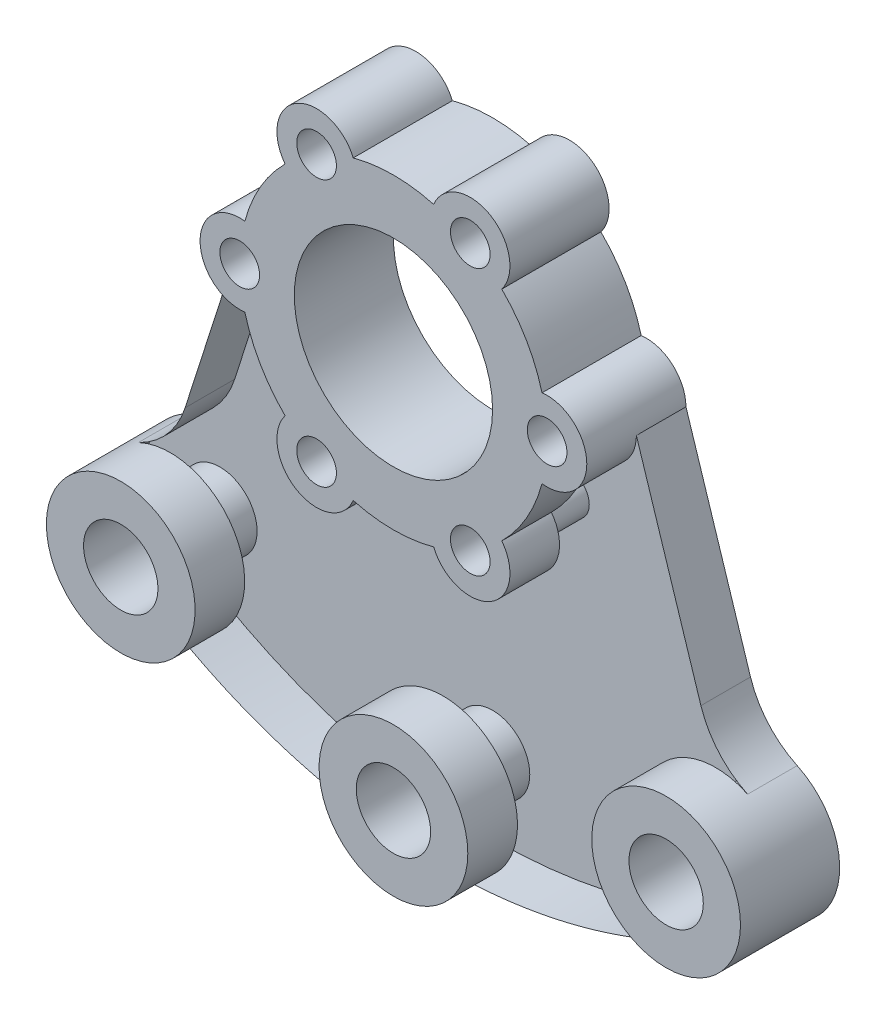
ISO-10303-21;
HEADER;
FILE_DESCRIPTION(('STEP AP214'),'2;1');
FILE_NAME('part.step','',(''),(''),'','','');
FILE_SCHEMA(('AUTOMOTIVE_DESIGN { 1 0 10303 214 1 1 1 1 }'));
ENDSEC;
DATA;
#1=APPLICATION_CONTEXT('core data for automotive mechanical design processes');
#2=APPLICATION_PROTOCOL_DEFINITION('international standard','automotive_design',2000,#1);
#3=PRODUCT_CONTEXT('',#1,'mechanical');
#4=PRODUCT('Part','Part','',(#3));
#5=PRODUCT_RELATED_PRODUCT_CATEGORY('part','',(#4));
#6=PRODUCT_DEFINITION_FORMATION('','',#4);
#7=PRODUCT_DEFINITION_CONTEXT('part definition',#1,'design');
#8=PRODUCT_DEFINITION('design','',#6,#7);
#9=PRODUCT_DEFINITION_SHAPE('','',#8);
#10=(LENGTH_UNIT() NAMED_UNIT(*) SI_UNIT(.MILLI.,.METRE.));
#11=(NAMED_UNIT(*) PLANE_ANGLE_UNIT() SI_UNIT($,.RADIAN.));
#12=(NAMED_UNIT(*) SI_UNIT($,.STERADIAN.) SOLID_ANGLE_UNIT());
#13=UNCERTAINTY_MEASURE_WITH_UNIT(LENGTH_MEASURE(1.E-05),#10,'distance_accuracy_value','');
#14=(GEOMETRIC_REPRESENTATION_CONTEXT(3) GLOBAL_UNCERTAINTY_ASSIGNED_CONTEXT((#13)) GLOBAL_UNIT_ASSIGNED_CONTEXT((#10,
#11,#12)) REPRESENTATION_CONTEXT('',''));
#15=CARTESIAN_POINT('',(0.,0.,0.));
#16=DIRECTION('',(0.,0.,1.));
#17=DIRECTION('',(1.,0.,0.));
#18=AXIS2_PLACEMENT_3D('',#15,#16,#17);
#19=CARTESIAN_POINT('',(0.,0.,20.));
#20=DIRECTION('',(0.,0.,-1.));
#21=DIRECTION('',(-1.,0.,0.));
#22=AXIS2_PLACEMENT_3D('',#19,#20,#21);
#23=CYLINDRICAL_SURFACE('',#22,31.);
#24=CARTESIAN_POINT('',(0.,0.,10.));
#25=DIRECTION('',(0.,0.,-1.));
#26=DIRECTION('',(-1.,0.,0.));
#27=AXIS2_PLACEMENT_3D('',#24,#25,#26);
#28=CIRCLE('',#27,31.);
#29=CARTESIAN_POINT('',(29.9677419354839,-7.93312317364614,10.));
#30=VERTEX_POINT('',#29);
#31=CARTESIAN_POINT('',(21.8541571674705,-21.9862642233623,10.));
#32=VERTEX_POINT('',#31);
#33=EDGE_CURVE('E65',#30,#32,#28,.T.);
#34=ORIENTED_EDGE('',*,*,#33,.F.);
#35=DIRECTION('',(0.,0.,-1.));
#36=VECTOR('',#35,1.);
#37=CARTESIAN_POINT('',(29.9677419354839,-7.93312317364614,20.));
#38=LINE('',#37,#36);
#39=CARTESIAN_POINT('',(29.9677419354839,-7.93312317364614,20.));
#40=VERTEX_POINT('',#39);
#41=EDGE_CURVE('E350',#40,#30,#38,.T.);
#42=ORIENTED_EDGE('',*,*,#41,.F.);
#43=CARTESIAN_POINT('',(0.,0.,20.));
#44=DIRECTION('',(0.,0.,1.));
#45=DIRECTION('',(1.,0.,0.));
#46=AXIS2_PLACEMENT_3D('',#43,#44,#45);
#47=CIRCLE('',#46,31.);
#48=CARTESIAN_POINT('',(21.8541571674705,-21.9862642233623,20.));
#49=VERTEX_POINT('',#48);
#50=EDGE_CURVE('E280',#49,#40,#47,.T.);
#51=ORIENTED_EDGE('',*,*,#50,.F.);
#52=DIRECTION('',(0.,0.,-1.));
#53=VECTOR('',#52,1.);
#54=CARTESIAN_POINT('',(21.8541571674705,-21.9862642233623,20.));
#55=LINE('',#54,#53);
#56=EDGE_CURVE('E306',#49,#32,#55,.T.);
#57=ORIENTED_EDGE('',*,*,#56,.T.);
#58=EDGE_LOOP('',(#34,#42,#51,#57));
#59=FACE_BOUND('',#58,.T.);
#60=ADVANCED_FACE('F43',(#59),#23,.T.);
#61=CARTESIAN_POINT('',(31.,0.,20.));
#62=DIRECTION('',(0.,0.,-1.));
#63=DIRECTION('',(-1.,0.,0.));
#64=AXIS2_PLACEMENT_3D('',#61,#62,#63);
#65=CYLINDRICAL_SURFACE('',#64,8.);
#66=DIRECTION('',(0.,0.,-1.));
#67=VECTOR('',#66,1.);
#68=CARTESIAN_POINT('',(39.,0.,10.));
#69=LINE('',#68,#67);
#70=CARTESIAN_POINT('',(39.,0.,10.));
#71=VERTEX_POINT('',#70);
#72=CARTESIAN_POINT('',(39.,0.,0.));
#73=VERTEX_POINT('',#72);
#74=EDGE_CURVE('E370',#71,#73,#69,.T.);
#75=ORIENTED_EDGE('',*,*,#74,.T.);
#76=CARTESIAN_POINT('',(31.,0.,0.));
#77=DIRECTION('',(0.,0.,1.));
#78=DIRECTION('',(1.,0.,0.));
#79=AXIS2_PLACEMENT_3D('',#76,#77,#78);
#80=CIRCLE('',#79,8.);
#81=CARTESIAN_POINT('',(29.9677419354839,7.93312317364614,0.));
#82=VERTEX_POINT('',#81);
#83=EDGE_CURVE('E277',#73,#82,#80,.T.);
#84=ORIENTED_EDGE('',*,*,#83,.T.);
#85=DIRECTION('',(0.,0.,-1.));
#86=VECTOR('',#85,1.);
#87=CARTESIAN_POINT('',(29.9677419354839,7.93312317364614,20.));
#88=LINE('',#87,#86);
#89=CARTESIAN_POINT('',(29.9677419354839,7.93312317364614,20.));
#90=VERTEX_POINT('',#89);
#91=EDGE_CURVE('E347',#90,#82,#88,.T.);
#92=ORIENTED_EDGE('',*,*,#91,.F.);
#93=CARTESIAN_POINT('',(31.,0.,20.));
#94=DIRECTION('',(0.,0.,1.));
#95=DIRECTION('',(1.,0.,0.));
#96=AXIS2_PLACEMENT_3D('',#93,#94,#95);
#97=CIRCLE('',#96,8.);
#98=EDGE_CURVE('E283',#40,#90,#97,.T.);
#99=ORIENTED_EDGE('',*,*,#98,.F.);
#100=ORIENTED_EDGE('',*,*,#41,.T.);
#101=CARTESIAN_POINT('',(31.,0.,10.));
#102=DIRECTION('',(0.,0.,-1.));
#103=DIRECTION('',(-1.,0.,0.));
#104=AXIS2_PLACEMENT_3D('',#101,#102,#103);
#105=CIRCLE('',#104,8.);
#106=EDGE_CURVE('E57',#71,#30,#105,.T.);
#107=ORIENTED_EDGE('',*,*,#106,.F.);
#108=EDGE_LOOP('',(#75,#84,#92,#99,#100,#107));
#109=FACE_BOUND('',#108,.T.);
#110=ADVANCED_FACE('F484',(#109),#65,.T.);
#111=CARTESIAN_POINT('',(-31.,2.16471843008274E-13,20.));
#112=DIRECTION('',(0.,0.,-1.));
#113=DIRECTION('',(-1.,0.,0.));
#114=AXIS2_PLACEMENT_3D('',#111,#112,#113);
#115=CYLINDRICAL_SURFACE('',#114,7.99999999999998);
#116=DIRECTION('',(0.,0.,-1.));
#117=VECTOR('',#116,1.);
#118=CARTESIAN_POINT('',(-39.,0.,10.));
#119=LINE('',#118,#117);
#120=CARTESIAN_POINT('',(-39.,0.,10.));
#121=VERTEX_POINT('',#120);
#122=CARTESIAN_POINT('',(-39.,0.,0.));
#123=VERTEX_POINT('',#122);
#124=EDGE_CURVE('E221',#121,#123,#119,.T.);
#125=ORIENTED_EDGE('',*,*,#124,.F.);
#126=CARTESIAN_POINT('',(-31.,2.16471843008274E-13,10.));
#127=DIRECTION('',(0.,0.,-1.));
#128=DIRECTION('',(-1.,0.,0.));
#129=AXIS2_PLACEMENT_3D('',#126,#127,#128);
#130=CIRCLE('',#129,7.99999999999998);
#131=CARTESIAN_POINT('',(-29.9677419354839,-7.93312317364591,10.));
#132=VERTEX_POINT('',#131);
#133=EDGE_CURVE('E239',#132,#121,#130,.T.);
#134=ORIENTED_EDGE('',*,*,#133,.F.);
#135=DIRECTION('',(0.,0.,-1.));
#136=VECTOR('',#135,1.);
#137=CARTESIAN_POINT('',(-29.9677419354839,-7.93312317364591,20.));
#138=LINE('',#137,#136);
#139=CARTESIAN_POINT('',(-29.9677419354839,-7.93312317364591,20.));
#140=VERTEX_POINT('',#139);
#141=EDGE_CURVE('E329',#140,#132,#138,.T.);
#142=ORIENTED_EDGE('',*,*,#141,.F.);
#143=CARTESIAN_POINT('',(-31.,2.16471843008274E-13,20.));
#144=DIRECTION('',(0.,0.,1.));
#145=DIRECTION('',(1.,0.,0.));
#146=AXIS2_PLACEMENT_3D('',#143,#144,#145);
#147=CIRCLE('',#146,7.99999999999998);
#148=CARTESIAN_POINT('',(-29.9677419354838,7.93312317364632,20.));
#149=VERTEX_POINT('',#148);
#150=EDGE_CURVE('E296',#149,#140,#147,.T.);
#151=ORIENTED_EDGE('',*,*,#150,.F.);
#152=DIRECTION('',(0.,0.,-1.));
#153=VECTOR('',#152,1.);
#154=CARTESIAN_POINT('',(-29.9677419354838,7.93312317364632,20.));
#155=LINE('',#154,#153);
#156=CARTESIAN_POINT('',(-29.9677419354838,7.93312317364632,0.));
#157=VERTEX_POINT('',#156);
#158=EDGE_CURVE('E332',#149,#157,#155,.T.);
#159=ORIENTED_EDGE('',*,*,#158,.T.);
#160=CARTESIAN_POINT('',(-31.,2.16471843008274E-13,0.));
#161=DIRECTION('',(0.,0.,1.));
#162=DIRECTION('',(1.,0.,0.));
#163=AXIS2_PLACEMENT_3D('',#160,#161,#162);
#164=CIRCLE('',#163,7.99999999999998);
#165=EDGE_CURVE('E284',#157,#123,#164,.T.);
#166=ORIENTED_EDGE('',*,*,#165,.T.);
#167=EDGE_LOOP('',(#125,#134,#142,#151,#159,#166));
#168=FACE_BOUND('',#167,.T.);
#169=ADVANCED_FACE('F426',(#168),#115,.T.);
#170=CARTESIAN_POINT('',(0.,0.,20.));
#171=DIRECTION('',(0.,0.,-1.));
#172=DIRECTION('',(-1.,0.,0.));
#173=AXIS2_PLACEMENT_3D('',#170,#171,#172);
#174=CYLINDRICAL_SURFACE('',#173,31.);
#175=CARTESIAN_POINT('',(0.,0.,10.));
#176=DIRECTION('',(0.,0.,-1.));
#177=DIRECTION('',(-1.,0.,0.));
#178=AXIS2_PLACEMENT_3D('',#175,#176,#177);
#179=CIRCLE('',#178,31.);
#180=CARTESIAN_POINT('',(-21.8541571674706,-21.9862642233621,10.));
#181=VERTEX_POINT('',#180);
#182=EDGE_CURVE('E236',#181,#132,#179,.T.);
#183=ORIENTED_EDGE('',*,*,#182,.F.);
#184=DIRECTION('',(0.,0.,-1.));
#185=VECTOR('',#184,1.);
#186=CARTESIAN_POINT('',(-21.8541571674706,-21.9862642233621,20.));
#187=LINE('',#186,#185);
#188=CARTESIAN_POINT('',(-21.8541571674706,-21.9862642233621,20.));
#189=VERTEX_POINT('',#188);
#190=EDGE_CURVE('E326',#189,#181,#187,.T.);
#191=ORIENTED_EDGE('',*,*,#190,.F.);
#192=CARTESIAN_POINT('',(0.,0.,20.));
#193=DIRECTION('',(0.,0.,1.));
#194=DIRECTION('',(1.,0.,0.));
#195=AXIS2_PLACEMENT_3D('',#192,#193,#194);
#196=CIRCLE('',#195,31.);
#197=EDGE_CURVE('E298',#140,#189,#196,.T.);
#198=ORIENTED_EDGE('',*,*,#197,.F.);
#199=ORIENTED_EDGE('',*,*,#141,.T.);
#200=EDGE_LOOP('',(#183,#191,#198,#199));
#201=FACE_BOUND('',#200,.T.);
#202=ADVANCED_FACE('F421',(#201),#174,.T.);
#203=CARTESIAN_POINT('',(-15.5000000000001,-26.8467875173175,20.));
#204=DIRECTION('',(0.,0.,-1.));
#205=DIRECTION('',(-1.,0.,0.));
#206=AXIS2_PLACEMENT_3D('',#203,#204,#205);
#207=CYLINDRICAL_SURFACE('',#206,8.);
#208=CARTESIAN_POINT('',(-15.5000000000001,-26.8467875173175,10.));
#209=DIRECTION('',(0.,0.,-1.));
#210=DIRECTION('',(-1.,0.,0.));
#211=AXIS2_PLACEMENT_3D('',#208,#209,#210);
#212=CIRCLE('',#211,8.);
#213=CARTESIAN_POINT('',(-8.11358476801349,-29.9193873970083,10.));
#214=VERTEX_POINT('',#213);
#215=EDGE_CURVE('E233',#214,#181,#212,.T.);
#216=ORIENTED_EDGE('',*,*,#215,.F.);
#217=DIRECTION('',(0.,0.,-1.));
#218=VECTOR('',#217,1.);
#219=CARTESIAN_POINT('',(-8.11358476801349,-29.9193873970083,20.));
#220=LINE('',#219,#218);
#221=CARTESIAN_POINT('',(-8.11358476801349,-29.9193873970083,20.));
#222=VERTEX_POINT('',#221);
#223=EDGE_CURVE('E323',#222,#214,#220,.T.);
#224=ORIENTED_EDGE('',*,*,#223,.F.);
#225=CARTESIAN_POINT('',(-15.5000000000001,-26.8467875173175,20.));
#226=DIRECTION('',(0.,0.,1.));
#227=DIRECTION('',(1.,0.,0.));
#228=AXIS2_PLACEMENT_3D('',#225,#226,#227);
#229=CIRCLE('',#228,8.);
#230=EDGE_CURVE('E300',#189,#222,#229,.T.);
#231=ORIENTED_EDGE('',*,*,#230,.F.);
#232=ORIENTED_EDGE('',*,*,#190,.T.);
#233=EDGE_LOOP('',(#216,#224,#231,#232));
#234=FACE_BOUND('',#233,.T.);
#235=ADVANCED_FACE('F418',(#234),#207,.T.);
#236=CARTESIAN_POINT('',(0.,0.,20.));
#237=DIRECTION('',(0.,0.,-1.));
#238=DIRECTION('',(-1.,0.,0.));
#239=AXIS2_PLACEMENT_3D('',#236,#237,#238);
#240=CYLINDRICAL_SURFACE('',#239,31.);
#241=CARTESIAN_POINT('',(0.,0.,10.));
#242=DIRECTION('',(0.,0.,-1.));
#243=DIRECTION('',(-1.,0.,0.));
#244=AXIS2_PLACEMENT_3D('',#241,#242,#243);
#245=CIRCLE('',#244,31.);
#246=CARTESIAN_POINT('',(8.11358476801328,-29.9193873970084,10.));
#247=VERTEX_POINT('',#246);
#248=EDGE_CURVE('E230',#247,#214,#245,.T.);
#249=ORIENTED_EDGE('',*,*,#248,.F.);
#250=DIRECTION('',(0.,0.,-1.));
#251=VECTOR('',#250,1.);
#252=CARTESIAN_POINT('',(8.11358476801328,-29.9193873970084,20.));
#253=LINE('',#252,#251);
#254=CARTESIAN_POINT('',(8.11358476801328,-29.9193873970084,20.));
#255=VERTEX_POINT('',#254);
#256=EDGE_CURVE('E320',#255,#247,#253,.T.);
#257=ORIENTED_EDGE('',*,*,#256,.F.);
#258=CARTESIAN_POINT('',(0.,0.,20.));
#259=DIRECTION('',(0.,0.,1.));
#260=DIRECTION('',(1.,0.,0.));
#261=AXIS2_PLACEMENT_3D('',#258,#259,#260);
#262=CIRCLE('',#261,31.);
#263=EDGE_CURVE('E302',#222,#255,#262,.T.);
#264=ORIENTED_EDGE('',*,*,#263,.F.);
#265=ORIENTED_EDGE('',*,*,#223,.T.);
#266=EDGE_LOOP('',(#249,#257,#264,#265));
#267=FACE_BOUND('',#266,.T.);
#268=ADVANCED_FACE('F416',(#267),#240,.T.);
#269=CARTESIAN_POINT('',(15.4999999999999,-26.8467875173176,20.));
#270=DIRECTION('',(0.,0.,-1.));
#271=DIRECTION('',(-1.,0.,0.));
#272=AXIS2_PLACEMENT_3D('',#269,#270,#271);
#273=CYLINDRICAL_SURFACE('',#272,8.);
#274=CARTESIAN_POINT('',(15.4999999999999,-26.8467875173176,10.));
#275=DIRECTION('',(0.,0.,-1.));
#276=DIRECTION('',(-1.,0.,0.));
#277=AXIS2_PLACEMENT_3D('',#274,#275,#276);
#278=CIRCLE('',#277,8.);
#279=EDGE_CURVE('E227',#32,#247,#278,.T.);
#280=ORIENTED_EDGE('',*,*,#279,.F.);
#281=ORIENTED_EDGE('',*,*,#56,.F.);
#282=CARTESIAN_POINT('',(15.4999999999999,-26.8467875173176,20.));
#283=DIRECTION('',(0.,0.,1.));
#284=DIRECTION('',(1.,0.,0.));
#285=AXIS2_PLACEMENT_3D('',#282,#283,#284);
#286=CIRCLE('',#285,8.);
#287=EDGE_CURVE('E304',#255,#49,#286,.T.);
#288=ORIENTED_EDGE('',*,*,#287,.F.);
#289=ORIENTED_EDGE('',*,*,#256,.T.);
#290=EDGE_LOOP('',(#280,#281,#288,#289));
#291=FACE_BOUND('',#290,.T.);
#292=ADVANCED_FACE('F404',(#291),#273,.T.);
#293=CARTESIAN_POINT('',(0.,0.,20.));
#294=DIRECTION('',(0.,0.,-1.));
#295=DIRECTION('',(-1.,0.,0.));
#296=AXIS2_PLACEMENT_3D('',#293,#294,#295);
#297=CYLINDRICAL_SURFACE('',#296,20.);
#298=CARTESIAN_POINT('',(0.,0.,20.));
#299=DIRECTION('',(0.,0.,1.));
#300=DIRECTION('',(1.,0.,0.));
#301=AXIS2_PLACEMENT_3D('',#298,#299,#300);
#302=CIRCLE('',#301,20.);
#303=CARTESIAN_POINT('',(20.,0.,20.));
#304=VERTEX_POINT('',#303);
#305=EDGE_CURVE('E274',#304,#304,#302,.T.);
#306=ORIENTED_EDGE('',*,*,#305,.T.);
#307=EDGE_LOOP('',(#306));
#308=FACE_BOUND('',#307,.T.);
#309=CARTESIAN_POINT('',(0.,0.,0.));
#310=DIRECTION('',(0.,0.,1.));
#311=DIRECTION('',(1.,0.,0.));
#312=AXIS2_PLACEMENT_3D('',#309,#310,#311);
#313=CIRCLE('',#312,20.);
#314=CARTESIAN_POINT('',(20.,0.,0.));
#315=VERTEX_POINT('',#314);
#316=EDGE_CURVE('E271',#315,#315,#313,.T.);
#317=ORIENTED_EDGE('',*,*,#316,.F.);
#318=EDGE_LOOP('',(#317));
#319=FACE_BOUND('',#318,.T.);
#320=ADVANCED_FACE('F523',(#308,#319),#297,.F.);
#321=CARTESIAN_POINT('',(31.,0.,20.));
#322=DIRECTION('',(0.,0.,-1.));
#323=DIRECTION('',(-1.,0.,0.));
#324=AXIS2_PLACEMENT_3D('',#321,#322,#323);
#325=CYLINDRICAL_SURFACE('',#324,4.00000000000001);
#326=CARTESIAN_POINT('',(31.,0.,20.));
#327=DIRECTION('',(0.,0.,1.));
#328=DIRECTION('',(1.,0.,0.));
#329=AXIS2_PLACEMENT_3D('',#326,#327,#328);
#330=CIRCLE('',#329,4.00000000000001);
#331=CARTESIAN_POINT('',(35.,0.,20.));
#332=VERTEX_POINT('',#331);
#333=EDGE_CURVE('E268',#332,#332,#330,.T.);
#334=ORIENTED_EDGE('',*,*,#333,.T.);
#335=EDGE_LOOP('',(#334));
#336=FACE_BOUND('',#335,.T.);
#337=CARTESIAN_POINT('',(31.,0.,0.));
#338=DIRECTION('',(0.,0.,1.));
#339=DIRECTION('',(1.,0.,0.));
#340=AXIS2_PLACEMENT_3D('',#337,#338,#339);
#341=CIRCLE('',#340,4.00000000000001);
#342=CARTESIAN_POINT('',(35.,0.,0.));
#343=VERTEX_POINT('',#342);
#344=EDGE_CURVE('E267',#343,#343,#341,.T.);
#345=ORIENTED_EDGE('',*,*,#344,.F.);
#346=EDGE_LOOP('',(#345));
#347=FACE_BOUND('',#346,.T.);
#348=ADVANCED_FACE('F532',(#336,#347),#325,.F.);
#349=CARTESIAN_POINT('',(15.4999999999999,-26.8467875173176,20.));
#350=DIRECTION('',(0.,0.,-1.));
#351=DIRECTION('',(-1.,0.,0.));
#352=AXIS2_PLACEMENT_3D('',#349,#350,#351);
#353=CYLINDRICAL_SURFACE('',#352,4.00000000000001);
#354=CARTESIAN_POINT('',(15.4999999999999,-26.8467875173176,20.));
#355=DIRECTION('',(0.,0.,1.));
#356=DIRECTION('',(1.,0.,0.));
#357=AXIS2_PLACEMENT_3D('',#354,#355,#356);
#358=CIRCLE('',#357,4.00000000000001);
#359=CARTESIAN_POINT('',(19.4999999999999,-26.8467875173176,20.));
#360=VERTEX_POINT('',#359);
#361=EDGE_CURVE('E264',#360,#360,#358,.T.);
#362=ORIENTED_EDGE('',*,*,#361,.T.);
#363=EDGE_LOOP('',(#362));
#364=FACE_BOUND('',#363,.T.);
#365=CARTESIAN_POINT('',(15.4999999999999,-26.8467875173176,0.));
#366=DIRECTION('',(0.,0.,1.));
#367=DIRECTION('',(1.,0.,0.));
#368=AXIS2_PLACEMENT_3D('',#365,#366,#367);
#369=CIRCLE('',#368,4.00000000000001);
#370=CARTESIAN_POINT('',(19.4999999999999,-26.8467875173176,0.));
#371=VERTEX_POINT('',#370);
#372=EDGE_CURVE('E453',#371,#371,#369,.T.);
#373=ORIENTED_EDGE('',*,*,#372,.F.);
#374=EDGE_LOOP('',(#373));
#375=FACE_BOUND('',#374,.T.);
#376=ADVANCED_FACE('F536',(#364,#375),#353,.F.);
#377=CARTESIAN_POINT('',(-15.5000000000001,-26.8467875173175,20.));
#378=DIRECTION('',(0.,0.,-1.));
#379=DIRECTION('',(-1.,0.,0.));
#380=AXIS2_PLACEMENT_3D('',#377,#378,#379);
#381=CYLINDRICAL_SURFACE('',#380,4.00000000000001);
#382=CARTESIAN_POINT('',(-15.5000000000001,-26.8467875173175,20.));
#383=DIRECTION('',(0.,0.,1.));
#384=DIRECTION('',(1.,0.,0.));
#385=AXIS2_PLACEMENT_3D('',#382,#383,#384);
#386=CIRCLE('',#385,4.00000000000001);
#387=CARTESIAN_POINT('',(-11.5000000000001,-26.8467875173175,20.));
#388=VERTEX_POINT('',#387);
#389=EDGE_CURVE('E259',#388,#388,#386,.T.);
#390=ORIENTED_EDGE('',*,*,#389,.T.);
#391=EDGE_LOOP('',(#390));
#392=FACE_BOUND('',#391,.T.);
#393=CARTESIAN_POINT('',(-15.5000000000001,-26.8467875173175,0.));
#394=DIRECTION('',(0.,0.,1.));
#395=DIRECTION('',(1.,0.,0.));
#396=AXIS2_PLACEMENT_3D('',#393,#394,#395);
#397=CIRCLE('',#396,4.);
#398=CARTESIAN_POINT('',(-11.5000000000001,-26.8467875173175,0.));
#399=VERTEX_POINT('',#398);
#400=EDGE_CURVE('E450',#399,#399,#397,.T.);
#401=ORIENTED_EDGE('',*,*,#400,.F.);
#402=EDGE_LOOP('',(#401));
#403=FACE_BOUND('',#402,.T.);
#404=ADVANCED_FACE('F540',(#392,#403),#381,.F.);
#405=CARTESIAN_POINT('',(-31.,2.16471843008274E-13,20.));
#406=DIRECTION('',(0.,0.,-1.));
#407=DIRECTION('',(-1.,0.,0.));
#408=AXIS2_PLACEMENT_3D('',#405,#406,#407);
#409=CYLINDRICAL_SURFACE('',#408,4.00000000000001);
#410=CARTESIAN_POINT('',(-31.,2.16471843008274E-13,20.));
#411=DIRECTION('',(0.,0.,1.));
#412=DIRECTION('',(1.,0.,0.));
#413=AXIS2_PLACEMENT_3D('',#410,#411,#412);
#414=CIRCLE('',#413,4.00000000000001);
#415=CARTESIAN_POINT('',(-27.,2.16471843008274E-13,20.));
#416=VERTEX_POINT('',#415);
#417=EDGE_CURVE('E256',#416,#416,#414,.T.);
#418=ORIENTED_EDGE('',*,*,#417,.T.);
#419=EDGE_LOOP('',(#418));
#420=FACE_BOUND('',#419,.T.);
#421=CARTESIAN_POINT('',(-31.,2.16471843008274E-13,0.));
#422=DIRECTION('',(0.,0.,1.));
#423=DIRECTION('',(1.,0.,0.));
#424=AXIS2_PLACEMENT_3D('',#421,#422,#423);
#425=CIRCLE('',#424,4.00000000000001);
#426=CARTESIAN_POINT('',(-27.,2.16471843008274E-13,0.));
#427=VERTEX_POINT('',#426);
#428=EDGE_CURVE('E253',#427,#427,#425,.T.);
#429=ORIENTED_EDGE('',*,*,#428,.F.);
#430=EDGE_LOOP('',(#429));
#431=FACE_BOUND('',#430,.T.);
#432=ADVANCED_FACE('F528',(#420,#431),#409,.F.);
#433=CARTESIAN_POINT('',(15.5,0.,20.));
#434=DIRECTION('',(0.,0.,1.));
#435=DIRECTION('',(1.,0.,0.));
#436=AXIS2_PLACEMENT_3D('',#433,#434,#435);
#437=PLANE('',#436);
#438=CARTESIAN_POINT('',(-15.4999999999997,26.8467875173177,20.));
#439=DIRECTION('',(0.,0.,1.));
#440=DIRECTION('',(1.,0.,0.));
#441=AXIS2_PLACEMENT_3D('',#438,#439,#440);
#442=CIRCLE('',#441,4.);
#443=CARTESIAN_POINT('',(-11.4999999999997,26.8467875173177,20.));
#444=VERTEX_POINT('',#443);
#445=EDGE_CURVE('E250',#444,#444,#442,.T.);
#446=ORIENTED_EDGE('',*,*,#445,.F.);
#447=EDGE_LOOP('',(#446));
#448=FACE_BOUND('',#447,.T.);
#449=ORIENTED_EDGE('',*,*,#389,.F.);
#450=EDGE_LOOP('',(#449));
#451=FACE_BOUND('',#450,.T.);
#452=ORIENTED_EDGE('',*,*,#333,.F.);
#453=EDGE_LOOP('',(#452));
#454=FACE_BOUND('',#453,.T.);
#455=ORIENTED_EDGE('',*,*,#50,.T.);
#456=ORIENTED_EDGE('',*,*,#98,.T.);
#457=CARTESIAN_POINT('',(0.,0.,20.));
#458=DIRECTION('',(0.,0.,1.));
#459=DIRECTION('',(1.,0.,0.));
#460=AXIS2_PLACEMENT_3D('',#457,#458,#459);
#461=CIRCLE('',#460,31.);
#462=CARTESIAN_POINT('',(21.8541571674708,21.9862642233619,20.));
#463=VERTEX_POINT('',#462);
#464=EDGE_CURVE('E286',#90,#463,#461,.T.);
#465=ORIENTED_EDGE('',*,*,#464,.T.);
#466=CARTESIAN_POINT('',(15.5000000000003,26.8467875173174,20.));
#467=DIRECTION('',(0.,0.,1.));
#468=DIRECTION('',(1.,0.,0.));
#469=AXIS2_PLACEMENT_3D('',#466,#467,#468);
#470=CIRCLE('',#469,8.);
#471=CARTESIAN_POINT('',(8.11358476801369,29.9193873970083,20.));
#472=VERTEX_POINT('',#471);
#473=EDGE_CURVE('E288',#463,#472,#470,.T.);
#474=ORIENTED_EDGE('',*,*,#473,.T.);
#475=CARTESIAN_POINT('',(0.,0.,20.));
#476=DIRECTION('',(0.,0.,1.));
#477=DIRECTION('',(1.,0.,0.));
#478=AXIS2_PLACEMENT_3D('',#475,#476,#477);
#479=CIRCLE('',#478,31.);
#480=CARTESIAN_POINT('',(-8.11358476801307,29.9193873970084,20.));
#481=VERTEX_POINT('',#480);
#482=EDGE_CURVE('E290',#472,#481,#479,.T.);
#483=ORIENTED_EDGE('',*,*,#482,.T.);
#484=CARTESIAN_POINT('',(-15.4999999999997,26.8467875173177,20.));
#485=DIRECTION('',(0.,0.,1.));
#486=DIRECTION('',(1.,0.,0.));
#487=AXIS2_PLACEMENT_3D('',#484,#485,#486);
#488=CIRCLE('',#487,8.);
#489=CARTESIAN_POINT('',(-21.8541571674703,21.9862642233624,20.));
#490=VERTEX_POINT('',#489);
#491=EDGE_CURVE('E292',#481,#490,#488,.T.);
#492=ORIENTED_EDGE('',*,*,#491,.T.);
#493=CARTESIAN_POINT('',(0.,0.,20.));
#494=DIRECTION('',(0.,0.,1.));
#495=DIRECTION('',(1.,0.,0.));
#496=AXIS2_PLACEMENT_3D('',#493,#494,#495);
#497=CIRCLE('',#496,31.);
#498=EDGE_CURVE('E294',#490,#149,#497,.T.);
#499=ORIENTED_EDGE('',*,*,#498,.T.);
#500=ORIENTED_EDGE('',*,*,#150,.T.);
#501=ORIENTED_EDGE('',*,*,#197,.T.);
#502=ORIENTED_EDGE('',*,*,#230,.T.);
#503=ORIENTED_EDGE('',*,*,#263,.T.);
#504=ORIENTED_EDGE('',*,*,#287,.T.);
#505=EDGE_LOOP('',(#455,#456,#465,#474,#483,#492,#499,#500,#501,#502,#503,#504));
#506=FACE_BOUND('',#505,.T.);
#507=ORIENTED_EDGE('',*,*,#305,.F.);
#508=EDGE_LOOP('',(#507));
#509=FACE_BOUND('',#508,.T.);
#510=ORIENTED_EDGE('',*,*,#361,.F.);
#511=EDGE_LOOP('',(#510));
#512=FACE_BOUND('',#511,.T.);
#513=ORIENTED_EDGE('',*,*,#417,.F.);
#514=EDGE_LOOP('',(#513));
#515=FACE_BOUND('',#514,.T.);
#516=CARTESIAN_POINT('',(15.5000000000003,26.8467875173174,20.));
#517=DIRECTION('',(0.,0.,1.));
#518=DIRECTION('',(1.,0.,0.));
#519=AXIS2_PLACEMENT_3D('',#516,#517,#518);
#520=CIRCLE('',#519,4.);
#521=CARTESIAN_POINT('',(19.5000000000003,26.8467875173174,20.));
#522=VERTEX_POINT('',#521);
#523=EDGE_CURVE('E244',#522,#522,#520,.T.);
#524=ORIENTED_EDGE('',*,*,#523,.F.);
#525=EDGE_LOOP('',(#524));
#526=FACE_BOUND('',#525,.T.);
#527=ADVANCED_FACE('F409',(#448,#451,#454,#506,#509,#512,#515,#526),#437,.T.);
#528=CARTESIAN_POINT('',(15.5,0.,0.));
#529=DIRECTION('',(0.,0.,1.));
#530=DIRECTION('',(1.,0.,0.));
#531=AXIS2_PLACEMENT_3D('',#528,#529,#530);
#532=PLANE('',#531);
#533=CARTESIAN_POINT('',(-55.,-65.,0.));
#534=DIRECTION('',(0.,0.,1.));
#535=DIRECTION('',(1.,0.,0.));
#536=AXIS2_PLACEMENT_3D('',#533,#534,#535);
#537=CIRCLE('',#536,7.5);
#538=CARTESIAN_POINT('',(-47.5,-65.,0.));
#539=VERTEX_POINT('',#538);
#540=EDGE_CURVE('E449',#539,#539,#537,.T.);
#541=ORIENTED_EDGE('',*,*,#540,.T.);
#542=EDGE_LOOP('',(#541));
#543=FACE_BOUND('',#542,.T.);
#544=CARTESIAN_POINT('',(0.,-80.,0.));
#545=DIRECTION('',(0.,0.,1.));
#546=DIRECTION('',(1.,0.,0.));
#547=AXIS2_PLACEMENT_3D('',#544,#545,#546);
#548=CIRCLE('',#547,7.5);
#549=CARTESIAN_POINT('',(7.50000000000002,-80.,0.));
#550=VERTEX_POINT('',#549);
#551=EDGE_CURVE('E459',#550,#550,#548,.T.);
#552=ORIENTED_EDGE('',*,*,#551,.T.);
#553=EDGE_LOOP('',(#552));
#554=FACE_BOUND('',#553,.T.);
#555=CARTESIAN_POINT('',(55.,-65.,0.));
#556=DIRECTION('',(0.,0.,1.));
#557=DIRECTION('',(1.,0.,0.));
#558=AXIS2_PLACEMENT_3D('',#555,#556,#557);
#559=CIRCLE('',#558,7.5);
#560=CARTESIAN_POINT('',(62.5,-65.,0.));
#561=VERTEX_POINT('',#560);
#562=EDGE_CURVE('E456',#561,#561,#559,.T.);
#563=ORIENTED_EDGE('',*,*,#562,.T.);
#564=EDGE_LOOP('',(#563));
#565=FACE_BOUND('',#564,.T.);
#566=ORIENTED_EDGE('',*,*,#372,.T.);
#567=EDGE_LOOP('',(#566));
#568=FACE_BOUND('',#567,.T.);
#569=ORIENTED_EDGE('',*,*,#400,.T.);
#570=EDGE_LOOP('',(#569));
#571=FACE_BOUND('',#570,.T.);
#572=CARTESIAN_POINT('',(0.,13.3333333333336,0.));
#573=DIRECTION('',(0.,0.,1.));
#574=DIRECTION('',(-1.,0.,0.));
#575=AXIS2_PLACEMENT_3D('',#572,#573,#574);
#576=CIRCLE('',#575,108.333333333334);
#577=CARTESIAN_POINT('',(-55.,-80.,0.));
#578=VERTEX_POINT('',#577);
#579=CARTESIAN_POINT('',(55.,-80.,0.));
#580=VERTEX_POINT('',#579);
#581=EDGE_CURVE('E376',#578,#580,#576,.T.);
#582=ORIENTED_EDGE('',*,*,#581,.F.);
#583=CARTESIAN_POINT('',(-55.,-65.,0.));
#584=DIRECTION('',(0.,0.,1.));
#585=DIRECTION('',(1.,0.,0.));
#586=AXIS2_PLACEMENT_3D('',#583,#584,#585);
#587=CIRCLE('',#586,15.);
#588=CARTESIAN_POINT('',(-61.4367406919948,-51.4512594952882,0.));
#589=VERTEX_POINT('',#588);
#590=EDGE_CURVE('E201',#589,#578,#587,.T.);
#591=ORIENTED_EDGE('',*,*,#590,.F.);
#592=CARTESIAN_POINT('',(-69.1608295223885,-35.192770889634,0.));
#593=DIRECTION('',(0.,0.,-1.));
#594=DIRECTION('',(-1.,0.,0.));
#595=AXIS2_PLACEMENT_3D('',#592,#593,#594);
#596=CIRCLE('',#595,18.);
#597=CARTESIAN_POINT('',(-52.0171948728007,-40.6787339775021,0.));
#598=VERTEX_POINT('',#597);
#599=EDGE_CURVE('E218',#598,#589,#596,.T.);
#600=ORIENTED_EDGE('',*,*,#599,.F.);
#601=DIRECTION('',(-0.304775727103784,-0.952424147199324,0.));
#602=VECTOR('',#601,1.);
#603=CARTESIAN_POINT('',(-39.,0.,0.));
#604=LINE('',#603,#602);
#605=EDGE_CURVE('E371',#123,#598,#604,.T.);
#606=ORIENTED_EDGE('',*,*,#605,.F.);
#607=ORIENTED_EDGE('',*,*,#165,.F.);
#608=CARTESIAN_POINT('',(0.,0.,0.));
#609=DIRECTION('',(0.,0.,1.));
#610=DIRECTION('',(1.,0.,0.));
#611=AXIS2_PLACEMENT_3D('',#608,#609,#610);
#612=CIRCLE('',#611,31.);
#613=CARTESIAN_POINT('',(-21.8541571674703,21.9862642233624,0.));
#614=VERTEX_POINT('',#613);
#615=EDGE_CURVE('E316',#614,#157,#612,.T.);
#616=ORIENTED_EDGE('',*,*,#615,.F.);
#617=CARTESIAN_POINT('',(-15.4999999999997,26.8467875173177,0.));
#618=DIRECTION('',(0.,0.,1.));
#619=DIRECTION('',(1.,0.,0.));
#620=AXIS2_PLACEMENT_3D('',#617,#618,#619);
#621=CIRCLE('',#620,8.);
#622=CARTESIAN_POINT('',(-8.11358476801307,29.9193873970084,0.));
#623=VERTEX_POINT('',#622);
#624=EDGE_CURVE('E314',#623,#614,#621,.T.);
#625=ORIENTED_EDGE('',*,*,#624,.F.);
#626=CARTESIAN_POINT('',(0.,0.,0.));
#627=DIRECTION('',(0.,0.,1.));
#628=DIRECTION('',(1.,0.,0.));
#629=AXIS2_PLACEMENT_3D('',#626,#627,#628);
#630=CIRCLE('',#629,31.);
#631=CARTESIAN_POINT('',(8.11358476801369,29.9193873970083,0.));
#632=VERTEX_POINT('',#631);
#633=EDGE_CURVE('E312',#632,#623,#630,.T.);
#634=ORIENTED_EDGE('',*,*,#633,.F.);
#635=CARTESIAN_POINT('',(15.5000000000003,26.8467875173174,0.));
#636=DIRECTION('',(0.,0.,1.));
#637=DIRECTION('',(1.,0.,0.));
#638=AXIS2_PLACEMENT_3D('',#635,#636,#637);
#639=CIRCLE('',#638,8.);
#640=CARTESIAN_POINT('',(21.8541571674708,21.9862642233619,0.));
#641=VERTEX_POINT('',#640);
#642=EDGE_CURVE('E310',#641,#632,#639,.T.);
#643=ORIENTED_EDGE('',*,*,#642,.F.);
#644=CARTESIAN_POINT('',(0.,0.,0.));
#645=DIRECTION('',(0.,0.,1.));
#646=DIRECTION('',(1.,0.,0.));
#647=AXIS2_PLACEMENT_3D('',#644,#645,#646);
#648=CIRCLE('',#647,31.);
#649=EDGE_CURVE('E308',#82,#641,#648,.T.);
#650=ORIENTED_EDGE('',*,*,#649,.F.);
#651=ORIENTED_EDGE('',*,*,#83,.F.);
#652=DIRECTION('',(-0.304775727103784,0.952424147199324,0.));
#653=VECTOR('',#652,1.);
#654=CARTESIAN_POINT('',(39.,0.,0.));
#655=LINE('',#654,#653);
#656=CARTESIAN_POINT('',(52.0171948728007,-40.6787339775021,0.));
#657=VERTEX_POINT('',#656);
#658=EDGE_CURVE('E382',#657,#73,#655,.T.);
#659=ORIENTED_EDGE('',*,*,#658,.F.);
#660=CARTESIAN_POINT('',(69.1608295223885,-35.192770889634,0.));
#661=DIRECTION('',(0.,0.,-1.));
#662=DIRECTION('',(1.,0.,0.));
#663=AXIS2_PLACEMENT_3D('',#660,#661,#662);
#664=CIRCLE('',#663,18.);
#665=CARTESIAN_POINT('',(61.4367406919948,-51.4512594952882,0.));
#666=VERTEX_POINT('',#665);
#667=EDGE_CURVE('E380',#666,#657,#664,.T.);
#668=ORIENTED_EDGE('',*,*,#667,.F.);
#669=CARTESIAN_POINT('',(55.,-65.,0.));
#670=DIRECTION('',(0.,0.,1.));
#671=DIRECTION('',(-1.,0.,0.));
#672=AXIS2_PLACEMENT_3D('',#669,#670,#671);
#673=CIRCLE('',#672,15.);
#674=EDGE_CURVE('E378',#580,#666,#673,.T.);
#675=ORIENTED_EDGE('',*,*,#674,.F.);
#676=EDGE_LOOP('',(#582,#591,#600,#606,#607,#616,#625,#634,#643,#650,#651,#659,#668,#675));
#677=FACE_BOUND('',#676,.T.);
#678=ORIENTED_EDGE('',*,*,#428,.T.);
#679=EDGE_LOOP('',(#678));
#680=FACE_BOUND('',#679,.T.);
#681=ORIENTED_EDGE('',*,*,#316,.T.);
#682=EDGE_LOOP('',(#681));
#683=FACE_BOUND('',#682,.T.);
#684=ORIENTED_EDGE('',*,*,#344,.T.);
#685=EDGE_LOOP('',(#684));
#686=FACE_BOUND('',#685,.T.);
#687=CARTESIAN_POINT('',(15.5000000000003,26.8467875173174,0.));
#688=DIRECTION('',(0.,0.,1.));
#689=DIRECTION('',(1.,0.,0.));
#690=AXIS2_PLACEMENT_3D('',#687,#688,#689);
#691=CIRCLE('',#690,4.);
#692=CARTESIAN_POINT('',(19.5000000000003,26.8467875173174,0.));
#693=VERTEX_POINT('',#692);
#694=EDGE_CURVE('E243',#693,#693,#691,.T.);
#695=ORIENTED_EDGE('',*,*,#694,.T.);
#696=EDGE_LOOP('',(#695));
#697=FACE_BOUND('',#696,.T.);
#698=CARTESIAN_POINT('',(-15.4999999999997,26.8467875173177,0.));
#699=DIRECTION('',(0.,0.,1.));
#700=DIRECTION('',(1.,0.,0.));
#701=AXIS2_PLACEMENT_3D('',#698,#699,#700);
#702=CIRCLE('',#701,4.);
#703=CARTESIAN_POINT('',(-11.4999999999997,26.8467875173177,0.));
#704=VERTEX_POINT('',#703);
#705=EDGE_CURVE('E247',#704,#704,#702,.T.);
#706=ORIENTED_EDGE('',*,*,#705,.T.);
#707=EDGE_LOOP('',(#706));
#708=FACE_BOUND('',#707,.T.);
#709=ADVANCED_FACE('F394',(#543,#554,#565,#568,#571,#677,#680,#683,#686,#697,#708),#532,.F.);
#710=CARTESIAN_POINT('',(0.,0.,20.));
#711=DIRECTION('',(0.,0.,-1.));
#712=DIRECTION('',(-1.,0.,0.));
#713=AXIS2_PLACEMENT_3D('',#710,#711,#712);
#714=CYLINDRICAL_SURFACE('',#713,31.);
#715=ORIENTED_EDGE('',*,*,#649,.T.);
#716=DIRECTION('',(0.,0.,-1.));
#717=VECTOR('',#716,1.);
#718=CARTESIAN_POINT('',(21.8541571674708,21.9862642233619,20.));
#719=LINE('',#718,#717);
#720=EDGE_CURVE('E344',#463,#641,#719,.T.);
#721=ORIENTED_EDGE('',*,*,#720,.F.);
#722=ORIENTED_EDGE('',*,*,#464,.F.);
#723=ORIENTED_EDGE('',*,*,#91,.T.);
#724=EDGE_LOOP('',(#715,#721,#722,#723));
#725=FACE_BOUND('',#724,.T.);
#726=ADVANCED_FACE('F494',(#725),#714,.T.);
#727=CARTESIAN_POINT('',(15.5000000000003,26.8467875173174,20.));
#728=DIRECTION('',(0.,0.,-1.));
#729=DIRECTION('',(-1.,0.,0.));
#730=AXIS2_PLACEMENT_3D('',#727,#728,#729);
#731=CYLINDRICAL_SURFACE('',#730,8.);
#732=ORIENTED_EDGE('',*,*,#642,.T.);
#733=DIRECTION('',(0.,0.,-1.));
#734=VECTOR('',#733,1.);
#735=CARTESIAN_POINT('',(8.11358476801369,29.9193873970083,20.));
#736=LINE('',#735,#734);
#737=EDGE_CURVE('E341',#472,#632,#736,.T.);
#738=ORIENTED_EDGE('',*,*,#737,.F.);
#739=ORIENTED_EDGE('',*,*,#473,.F.);
#740=ORIENTED_EDGE('',*,*,#720,.T.);
#741=EDGE_LOOP('',(#732,#738,#739,#740));
#742=FACE_BOUND('',#741,.T.);
#743=ADVANCED_FACE('F497',(#742),#731,.T.);
#744=CARTESIAN_POINT('',(0.,0.,20.));
#745=DIRECTION('',(0.,0.,-1.));
#746=DIRECTION('',(-1.,0.,0.));
#747=AXIS2_PLACEMENT_3D('',#744,#745,#746);
#748=CYLINDRICAL_SURFACE('',#747,31.);
#749=ORIENTED_EDGE('',*,*,#633,.T.);
#750=DIRECTION('',(0.,0.,-1.));
#751=VECTOR('',#750,1.);
#752=CARTESIAN_POINT('',(-8.11358476801307,29.9193873970084,20.));
#753=LINE('',#752,#751);
#754=EDGE_CURVE('E338',#481,#623,#753,.T.);
#755=ORIENTED_EDGE('',*,*,#754,.F.);
#756=ORIENTED_EDGE('',*,*,#482,.F.);
#757=ORIENTED_EDGE('',*,*,#737,.T.);
#758=EDGE_LOOP('',(#749,#755,#756,#757));
#759=FACE_BOUND('',#758,.T.);
#760=ADVANCED_FACE('F501',(#759),#748,.T.);
#761=CARTESIAN_POINT('',(-15.4999999999997,26.8467875173177,20.));
#762=DIRECTION('',(0.,0.,-1.));
#763=DIRECTION('',(-1.,0.,0.));
#764=AXIS2_PLACEMENT_3D('',#761,#762,#763);
#765=CYLINDRICAL_SURFACE('',#764,8.);
#766=ORIENTED_EDGE('',*,*,#624,.T.);
#767=DIRECTION('',(0.,0.,-1.));
#768=VECTOR('',#767,1.);
#769=CARTESIAN_POINT('',(-21.8541571674703,21.9862642233624,20.));
#770=LINE('',#769,#768);
#771=EDGE_CURVE('E335',#490,#614,#770,.T.);
#772=ORIENTED_EDGE('',*,*,#771,.F.);
#773=ORIENTED_EDGE('',*,*,#491,.F.);
#774=ORIENTED_EDGE('',*,*,#754,.T.);
#775=EDGE_LOOP('',(#766,#772,#773,#774));
#776=FACE_BOUND('',#775,.T.);
#777=ADVANCED_FACE('F505',(#776),#765,.T.);
#778=CARTESIAN_POINT('',(0.,0.,20.));
#779=DIRECTION('',(0.,0.,-1.));
#780=DIRECTION('',(-1.,0.,0.));
#781=AXIS2_PLACEMENT_3D('',#778,#779,#780);
#782=CYLINDRICAL_SURFACE('',#781,31.);
#783=ORIENTED_EDGE('',*,*,#615,.T.);
#784=ORIENTED_EDGE('',*,*,#158,.F.);
#785=ORIENTED_EDGE('',*,*,#498,.F.);
#786=ORIENTED_EDGE('',*,*,#771,.T.);
#787=EDGE_LOOP('',(#783,#784,#785,#786));
#788=FACE_BOUND('',#787,.T.);
#789=ADVANCED_FACE('F509',(#788),#782,.T.);
#790=CARTESIAN_POINT('',(-15.4999999999997,26.8467875173177,20.));
#791=DIRECTION('',(0.,0.,-1.));
#792=DIRECTION('',(-1.,0.,0.));
#793=AXIS2_PLACEMENT_3D('',#790,#791,#792);
#794=CYLINDRICAL_SURFACE('',#793,4.);
#795=ORIENTED_EDGE('',*,*,#445,.T.);
#796=EDGE_LOOP('',(#795));
#797=FACE_BOUND('',#796,.T.);
#798=ORIENTED_EDGE('',*,*,#705,.F.);
#799=EDGE_LOOP('',(#798));
#800=FACE_BOUND('',#799,.T.);
#801=ADVANCED_FACE('F512',(#797,#800),#794,.F.);
#802=CARTESIAN_POINT('',(15.5000000000003,26.8467875173174,20.));
#803=DIRECTION('',(0.,0.,-1.));
#804=DIRECTION('',(-1.,0.,0.));
#805=AXIS2_PLACEMENT_3D('',#802,#803,#804);
#806=CYLINDRICAL_SURFACE('',#805,4.);
#807=ORIENTED_EDGE('',*,*,#523,.T.);
#808=EDGE_LOOP('',(#807));
#809=FACE_BOUND('',#808,.T.);
#810=ORIENTED_EDGE('',*,*,#694,.F.);
#811=EDGE_LOOP('',(#810));
#812=FACE_BOUND('',#811,.T.);
#813=ADVANCED_FACE('F550',(#809,#812),#806,.F.);
#814=CARTESIAN_POINT('',(-39.,0.,10.));
#815=DIRECTION('',(0.952424147199324,-0.304775727103784,0.));
#816=DIRECTION('',(0.304775727103784,0.952424147199324,0.));
#817=AXIS2_PLACEMENT_3D('',#814,#815,#816);
#818=PLANE('',#817);
#819=ORIENTED_EDGE('',*,*,#605,.T.);
#820=DIRECTION('',(0.,0.,-1.));
#821=VECTOR('',#820,1.);
#822=CARTESIAN_POINT('',(-52.0171948728007,-40.6787339775021,10.));
#823=LINE('',#822,#821);
#824=CARTESIAN_POINT('',(-52.0171948728007,-40.6787339775021,10.));
#825=VERTEX_POINT('',#824);
#826=EDGE_CURVE('E219',#825,#598,#823,.T.);
#827=ORIENTED_EDGE('',*,*,#826,.F.);
#828=DIRECTION('',(-0.304775727103784,-0.952424147199324,0.));
#829=VECTOR('',#828,1.);
#830=CARTESIAN_POINT('',(-39.,0.,10.));
#831=LINE('',#830,#829);
#832=EDGE_CURVE('E211',#121,#825,#831,.T.);
#833=ORIENTED_EDGE('',*,*,#832,.F.);
#834=ORIENTED_EDGE('',*,*,#124,.T.);
#835=EDGE_LOOP('',(#819,#827,#833,#834));
#836=FACE_BOUND('',#835,.T.);
#837=ADVANCED_FACE('F430',(#836),#818,.F.);
#838=CARTESIAN_POINT('',(-69.1608295223885,-35.192770889634,10.));
#839=DIRECTION('',(0.,0.,-1.));
#840=DIRECTION('',(-1.,0.,0.));
#841=AXIS2_PLACEMENT_3D('',#838,#839,#840);
#842=CYLINDRICAL_SURFACE('',#841,18.);
#843=ORIENTED_EDGE('',*,*,#599,.T.);
#844=DIRECTION('',(0.,0.,-1.));
#845=VECTOR('',#844,1.);
#846=CARTESIAN_POINT('',(-61.4367406919948,-51.4512594952882,10.));
#847=LINE('',#846,#845);
#848=CARTESIAN_POINT('',(-61.4367406919948,-51.4512594952882,10.));
#849=VERTEX_POINT('',#848);
#850=EDGE_CURVE('E202',#849,#589,#847,.T.);
#851=ORIENTED_EDGE('',*,*,#850,.F.);
#852=CARTESIAN_POINT('',(-69.1608295223885,-35.192770889634,10.));
#853=DIRECTION('',(0.,0.,-1.));
#854=DIRECTION('',(-1.,0.,0.));
#855=AXIS2_PLACEMENT_3D('',#852,#853,#854);
#856=CIRCLE('',#855,18.);
#857=EDGE_CURVE('E207',#825,#849,#856,.T.);
#858=ORIENTED_EDGE('',*,*,#857,.F.);
#859=ORIENTED_EDGE('',*,*,#826,.T.);
#860=EDGE_LOOP('',(#843,#851,#858,#859));
#861=FACE_BOUND('',#860,.T.);
#862=ADVANCED_FACE('F216',(#861),#842,.F.);
#863=CARTESIAN_POINT('',(-55.,-65.,10.));
#864=DIRECTION('',(0.,0.,-1.));
#865=DIRECTION('',(-1.,0.,0.));
#866=AXIS2_PLACEMENT_3D('',#863,#864,#865);
#867=CYLINDRICAL_SURFACE('',#866,15.);
#868=ORIENTED_EDGE('',*,*,#590,.T.);
#869=DIRECTION('',(0.,0.,-1.));
#870=VECTOR('',#869,1.);
#871=CARTESIAN_POINT('',(-55.,-80.,10.));
#872=LINE('',#871,#870);
#873=CARTESIAN_POINT('',(-55.,-80.,10.));
#874=VERTEX_POINT('',#873);
#875=EDGE_CURVE('E187',#874,#578,#872,.T.);
#876=ORIENTED_EDGE('',*,*,#875,.F.);
#877=CARTESIAN_POINT('',(-55.,-65.,10.));
#878=DIRECTION('',(0.,0.,-1.));
#879=DIRECTION('',(-1.,0.,0.));
#880=AXIS2_PLACEMENT_3D('',#877,#878,#879);
#881=CIRCLE('',#880,15.);
#882=EDGE_CURVE('E11',#874,#849,#881,.F.);
#883=ORIENTED_EDGE('',*,*,#882,.T.);
#884=ORIENTED_EDGE('',*,*,#850,.T.);
#885=EDGE_LOOP('',(#868,#876,#883,#884));
#886=FACE_BOUND('',#885,.T.);
#887=CARTESIAN_POINT('',(-55.,-65.,20.));
#888=DIRECTION('',(0.,0.,1.));
#889=DIRECTION('',(-1.,0.,0.));
#890=AXIS2_PLACEMENT_3D('',#887,#888,#889);
#891=CIRCLE('',#890,15.);
#892=CARTESIAN_POINT('',(-70.,-65.,20.));
#893=VERTEX_POINT('',#892);
#894=EDGE_CURVE('E446',#893,#893,#891,.T.);
#895=ORIENTED_EDGE('',*,*,#894,.F.);
#896=EDGE_LOOP('',(#895));
#897=FACE_BOUND('',#896,.T.);
#898=ADVANCED_FACE('F197',(#886,#897),#867,.T.);
#899=CARTESIAN_POINT('',(0.,13.3333333333336,10.));
#900=DIRECTION('',(0.,0.,-1.));
#901=DIRECTION('',(-1.,0.,0.));
#902=AXIS2_PLACEMENT_3D('',#899,#900,#901);
#903=CYLINDRICAL_SURFACE('',#902,108.333333333334);
#904=CARTESIAN_POINT('',(0.,13.3333333333336,10.));
#905=DIRECTION('',(0.,0.,1.));
#906=DIRECTION('',(-1.,0.,0.));
#907=AXIS2_PLACEMENT_3D('',#904,#905,#906);
#908=CIRCLE('',#907,108.333333333334);
#909=CARTESIAN_POINT('',(0.,-95.,10.));
#910=VERTEX_POINT('',#909);
#911=CARTESIAN_POINT('',(55.,-80.,10.));
#912=VERTEX_POINT('',#911);
#913=EDGE_CURVE('E190',#910,#912,#908,.T.);
#914=ORIENTED_EDGE('',*,*,#913,.F.);
#915=EDGE_CURVE('E184',#874,#910,#908,.T.);
#916=ORIENTED_EDGE('',*,*,#915,.F.);
#917=ORIENTED_EDGE('',*,*,#875,.T.);
#918=ORIENTED_EDGE('',*,*,#581,.T.);
#919=DIRECTION('',(0.,0.,-1.));
#920=VECTOR('',#919,1.);
#921=CARTESIAN_POINT('',(55.,-80.,10.));
#922=LINE('',#921,#920);
#923=EDGE_CURVE('E203',#912,#580,#922,.T.);
#924=ORIENTED_EDGE('',*,*,#923,.F.);
#925=EDGE_LOOP('',(#914,#916,#917,#918,#924));
#926=FACE_BOUND('',#925,.T.);
#927=ADVANCED_FACE('F186',(#926),#903,.T.);
#928=CARTESIAN_POINT('',(55.,-65.,10.));
#929=DIRECTION('',(0.,0.,-1.));
#930=DIRECTION('',(-1.,0.,0.));
#931=AXIS2_PLACEMENT_3D('',#928,#929,#930);
#932=CYLINDRICAL_SURFACE('',#931,15.);
#933=ORIENTED_EDGE('',*,*,#674,.T.);
#934=DIRECTION('',(0.,0.,-1.));
#935=VECTOR('',#934,1.);
#936=CARTESIAN_POINT('',(61.4367406919948,-51.4512594952882,10.));
#937=LINE('',#936,#935);
#938=CARTESIAN_POINT('',(61.4367406919948,-51.4512594952882,10.));
#939=VERTEX_POINT('',#938);
#940=EDGE_CURVE('E362',#939,#666,#937,.T.);
#941=ORIENTED_EDGE('',*,*,#940,.F.);
#942=CARTESIAN_POINT('',(55.,-65.,10.));
#943=DIRECTION('',(0.,0.,-1.));
#944=DIRECTION('',(-1.,0.,0.));
#945=AXIS2_PLACEMENT_3D('',#942,#943,#944);
#946=CIRCLE('',#945,15.);
#947=EDGE_CURVE('E50',#939,#912,#946,.F.);
#948=ORIENTED_EDGE('',*,*,#947,.T.);
#949=ORIENTED_EDGE('',*,*,#923,.T.);
#950=EDGE_LOOP('',(#933,#941,#948,#949));
#951=FACE_BOUND('',#950,.T.);
#952=CARTESIAN_POINT('',(55.,-65.,20.));
#953=DIRECTION('',(0.,0.,1.));
#954=DIRECTION('',(1.,0.,0.));
#955=AXIS2_PLACEMENT_3D('',#952,#953,#954);
#956=CIRCLE('',#955,15.);
#957=CARTESIAN_POINT('',(70.,-65.,20.));
#958=VERTEX_POINT('',#957);
#959=EDGE_CURVE('E440',#958,#958,#956,.T.);
#960=ORIENTED_EDGE('',*,*,#959,.F.);
#961=EDGE_LOOP('',(#960));
#962=FACE_BOUND('',#961,.T.);
#963=ADVANCED_FACE('F358',(#951,#962),#932,.T.);
#964=CARTESIAN_POINT('',(69.1608295223885,-35.192770889634,10.));
#965=DIRECTION('',(0.,0.,-1.));
#966=DIRECTION('',(-1.,0.,0.));
#967=AXIS2_PLACEMENT_3D('',#964,#965,#966);
#968=CYLINDRICAL_SURFACE('',#967,18.);
#969=ORIENTED_EDGE('',*,*,#667,.T.);
#970=DIRECTION('',(0.,0.,-1.));
#971=VECTOR('',#970,1.);
#972=CARTESIAN_POINT('',(52.0171948728007,-40.6787339775021,10.));
#973=LINE('',#972,#971);
#974=CARTESIAN_POINT('',(52.0171948728007,-40.6787339775021,10.));
#975=VERTEX_POINT('',#974);
#976=EDGE_CURVE('E386',#975,#657,#973,.T.);
#977=ORIENTED_EDGE('',*,*,#976,.F.);
#978=CARTESIAN_POINT('',(69.1608295223885,-35.192770889634,10.));
#979=DIRECTION('',(0.,0.,-1.));
#980=DIRECTION('',(1.,0.,0.));
#981=AXIS2_PLACEMENT_3D('',#978,#979,#980);
#982=CIRCLE('',#981,18.);
#983=EDGE_CURVE('E194',#939,#975,#982,.T.);
#984=ORIENTED_EDGE('',*,*,#983,.F.);
#985=ORIENTED_EDGE('',*,*,#940,.T.);
#986=EDGE_LOOP('',(#969,#977,#984,#985));
#987=FACE_BOUND('',#986,.T.);
#988=ADVANCED_FACE('F391',(#987),#968,.F.);
#989=CARTESIAN_POINT('',(39.,0.,10.));
#990=DIRECTION('',(-0.952424147199324,-0.304775727103784,0.));
#991=DIRECTION('',(0.304775727103784,-0.952424147199324,0.));
#992=AXIS2_PLACEMENT_3D('',#989,#990,#991);
#993=PLANE('',#992);
#994=ORIENTED_EDGE('',*,*,#658,.T.);
#995=ORIENTED_EDGE('',*,*,#74,.F.);
#996=DIRECTION('',(-0.304775727103784,0.952424147199324,0.));
#997=VECTOR('',#996,1.);
#998=CARTESIAN_POINT('',(39.,0.,10.));
#999=LINE('',#998,#997);
#1000=EDGE_CURVE('E368',#975,#71,#999,.T.);
#1001=ORIENTED_EDGE('',*,*,#1000,.F.);
#1002=ORIENTED_EDGE('',*,*,#976,.T.);
#1003=EDGE_LOOP('',(#994,#995,#1001,#1002));
#1004=FACE_BOUND('',#1003,.T.);
#1005=ADVANCED_FACE('F400',(#1004),#993,.F.);
#1006=CARTESIAN_POINT('',(-69.1608295223885,-35.192770889634,10.));
#1007=DIRECTION('',(0.,0.,-1.));
#1008=DIRECTION('',(-1.,0.,0.));
#1009=AXIS2_PLACEMENT_3D('',#1006,#1007,#1008);
#1010=PLANE('',#1009);
#1011=ORIENTED_EDGE('',*,*,#882,.F.);
#1012=ORIENTED_EDGE('',*,*,#915,.T.);
#1013=CARTESIAN_POINT('',(0.,-80.,10.));
#1014=DIRECTION('',(0.,0.,-1.));
#1015=DIRECTION('',(-1.,0.,0.));
#1016=AXIS2_PLACEMENT_3D('',#1013,#1014,#1015);
#1017=CIRCLE('',#1016,15.);
#1018=EDGE_CURVE('E352',#910,#910,#1017,.F.);
#1019=ORIENTED_EDGE('',*,*,#1018,.F.);
#1020=ORIENTED_EDGE('',*,*,#913,.T.);
#1021=ORIENTED_EDGE('',*,*,#947,.F.);
#1022=ORIENTED_EDGE('',*,*,#983,.T.);
#1023=ORIENTED_EDGE('',*,*,#1000,.T.);
#1024=ORIENTED_EDGE('',*,*,#106,.T.);
#1025=ORIENTED_EDGE('',*,*,#33,.T.);
#1026=ORIENTED_EDGE('',*,*,#279,.T.);
#1027=ORIENTED_EDGE('',*,*,#248,.T.);
#1028=ORIENTED_EDGE('',*,*,#215,.T.);
#1029=ORIENTED_EDGE('',*,*,#182,.T.);
#1030=ORIENTED_EDGE('',*,*,#133,.T.);
#1031=ORIENTED_EDGE('',*,*,#832,.T.);
#1032=ORIENTED_EDGE('',*,*,#857,.T.);
#1033=EDGE_LOOP('',(#1011,#1012,#1019,#1020,#1021,#1022,#1023,#1024,#1025,#1026,#1027,#1028,
#1029,#1030,#1031,#1032));
#1034=FACE_BOUND('',#1033,.T.);
#1035=ADVANCED_FACE('F205',(#1034),#1010,.F.);
#1036=CARTESIAN_POINT('',(0.,-80.,20.));
#1037=DIRECTION('',(0.,0.,-1.));
#1038=DIRECTION('',(-1.,0.,0.));
#1039=AXIS2_PLACEMENT_3D('',#1036,#1037,#1038);
#1040=CYLINDRICAL_SURFACE('',#1039,15.);
#1041=CARTESIAN_POINT('',(0.,-80.,20.));
#1042=DIRECTION('',(0.,0.,1.));
#1043=DIRECTION('',(1.,0.,0.));
#1044=AXIS2_PLACEMENT_3D('',#1041,#1042,#1043);
#1045=CIRCLE('',#1044,15.);
#1046=CARTESIAN_POINT('',(15.,-80.,20.));
#1047=VERTEX_POINT('',#1046);
#1048=EDGE_CURVE('E434',#1047,#1047,#1045,.T.);
#1049=ORIENTED_EDGE('',*,*,#1048,.F.);
#1050=EDGE_LOOP('',(#1049));
#1051=FACE_BOUND('',#1050,.T.);
#1052=ORIENTED_EDGE('',*,*,#1018,.T.);
#1053=EDGE_LOOP('',(#1052));
#1054=FACE_BOUND('',#1053,.T.);
#1055=ADVANCED_FACE('F570',(#1051,#1054),#1040,.T.);
#1056=CARTESIAN_POINT('',(0.,-80.,20.));
#1057=DIRECTION('',(0.,0.,-1.));
#1058=DIRECTION('',(-1.,0.,0.));
#1059=AXIS2_PLACEMENT_3D('',#1056,#1057,#1058);
#1060=CYLINDRICAL_SURFACE('',#1059,7.5);
#1061=CARTESIAN_POINT('',(0.,-80.,20.));
#1062=DIRECTION('',(0.,0.,1.));
#1063=DIRECTION('',(1.,0.,0.));
#1064=AXIS2_PLACEMENT_3D('',#1061,#1062,#1063);
#1065=CIRCLE('',#1064,7.5);
#1066=CARTESIAN_POINT('',(7.50000000000002,-80.,20.));
#1067=VERTEX_POINT('',#1066);
#1068=EDGE_CURVE('E373',#1067,#1067,#1065,.T.);
#1069=ORIENTED_EDGE('',*,*,#1068,.T.);
#1070=EDGE_LOOP('',(#1069));
#1071=FACE_BOUND('',#1070,.T.);
#1072=ORIENTED_EDGE('',*,*,#551,.F.);
#1073=EDGE_LOOP('',(#1072));
#1074=FACE_BOUND('',#1073,.T.);
#1075=ADVANCED_FACE('F571',(#1071,#1074),#1060,.F.);
#1076=CARTESIAN_POINT('',(0.,-80.,20.));
#1077=DIRECTION('',(0.,0.,1.));
#1078=DIRECTION('',(1.,0.,0.));
#1079=AXIS2_PLACEMENT_3D('',#1076,#1077,#1078);
#1080=PLANE('',#1079);
#1081=ORIENTED_EDGE('',*,*,#1048,.T.);
#1082=EDGE_LOOP('',(#1081));
#1083=FACE_BOUND('',#1082,.T.);
#1084=ORIENTED_EDGE('',*,*,#1068,.F.);
#1085=EDGE_LOOP('',(#1084));
#1086=FACE_BOUND('',#1085,.T.);
#1087=ADVANCED_FACE('F574',(#1083,#1086),#1080,.T.);
#1088=CARTESIAN_POINT('',(55.,-65.,20.));
#1089=DIRECTION('',(0.,0.,-1.));
#1090=DIRECTION('',(-1.,0.,0.));
#1091=AXIS2_PLACEMENT_3D('',#1088,#1089,#1090);
#1092=CYLINDRICAL_SURFACE('',#1091,7.5);
#1093=CARTESIAN_POINT('',(55.,-65.,20.));
#1094=DIRECTION('',(0.,0.,1.));
#1095=DIRECTION('',(1.,0.,0.));
#1096=AXIS2_PLACEMENT_3D('',#1093,#1094,#1095);
#1097=CIRCLE('',#1096,7.5);
#1098=CARTESIAN_POINT('',(62.5,-65.,20.));
#1099=VERTEX_POINT('',#1098);
#1100=EDGE_CURVE('E437',#1099,#1099,#1097,.T.);
#1101=ORIENTED_EDGE('',*,*,#1100,.T.);
#1102=EDGE_LOOP('',(#1101));
#1103=FACE_BOUND('',#1102,.T.);
#1104=ORIENTED_EDGE('',*,*,#562,.F.);
#1105=EDGE_LOOP('',(#1104));
#1106=FACE_BOUND('',#1105,.T.);
#1107=ADVANCED_FACE('F480',(#1103,#1106),#1092,.F.);
#1108=CARTESIAN_POINT('',(55.,-65.,20.));
#1109=DIRECTION('',(0.,0.,1.));
#1110=DIRECTION('',(1.,0.,0.));
#1111=AXIS2_PLACEMENT_3D('',#1108,#1109,#1110);
#1112=PLANE('',#1111);
#1113=ORIENTED_EDGE('',*,*,#959,.T.);
#1114=EDGE_LOOP('',(#1113));
#1115=FACE_BOUND('',#1114,.T.);
#1116=ORIENTED_EDGE('',*,*,#1100,.F.);
#1117=EDGE_LOOP('',(#1116));
#1118=FACE_BOUND('',#1117,.T.);
#1119=ADVANCED_FACE('F470',(#1115,#1118),#1112,.T.);
#1120=CARTESIAN_POINT('',(-55.,-65.,20.));
#1121=DIRECTION('',(0.,0.,-1.));
#1122=DIRECTION('',(-1.,0.,0.));
#1123=AXIS2_PLACEMENT_3D('',#1120,#1121,#1122);
#1124=CYLINDRICAL_SURFACE('',#1123,7.5);
#1125=CARTESIAN_POINT('',(-55.,-65.,20.));
#1126=DIRECTION('',(0.,0.,1.));
#1127=DIRECTION('',(-1.,0.,0.));
#1128=AXIS2_PLACEMENT_3D('',#1125,#1126,#1127);
#1129=CIRCLE('',#1128,7.5);
#1130=CARTESIAN_POINT('',(-62.5,-65.,20.));
#1131=VERTEX_POINT('',#1130);
#1132=EDGE_CURVE('E443',#1131,#1131,#1129,.T.);
#1133=ORIENTED_EDGE('',*,*,#1132,.T.);
#1134=EDGE_LOOP('',(#1133));
#1135=FACE_BOUND('',#1134,.T.);
#1136=ORIENTED_EDGE('',*,*,#540,.F.);
#1137=EDGE_LOOP('',(#1136));
#1138=FACE_BOUND('',#1137,.T.);
#1139=ADVANCED_FACE('F467',(#1135,#1138),#1124,.F.);
#1140=CARTESIAN_POINT('',(-55.,-65.,20.));
#1141=DIRECTION('',(0.,0.,-1.));
#1142=DIRECTION('',(-1.,0.,0.));
#1143=AXIS2_PLACEMENT_3D('',#1140,#1141,#1142);
#1144=PLANE('',#1143);
#1145=ORIENTED_EDGE('',*,*,#894,.T.);
#1146=EDGE_LOOP('',(#1145));
#1147=FACE_BOUND('',#1146,.T.);
#1148=ORIENTED_EDGE('',*,*,#1132,.F.);
#1149=EDGE_LOOP('',(#1148));
#1150=FACE_BOUND('',#1149,.T.);
#1151=ADVANCED_FACE('F469',(#1147,#1150),#1144,.F.);
#1152=CLOSED_SHELL('',(#60,#110,#169,#202,#235,#268,#292,#320,#348,#376,#404,#432,#527,#709,
#726,#743,#760,#777,#789,#801,#813,#837,#862,#898,#927,#963,#988,#1005,#1035,#1055,#1075,#1087,
#1107,#1119,#1139,#1151));
#1153=MANIFOLD_SOLID_BREP('B2',#1152);
#1154=ADVANCED_BREP_SHAPE_REPRESENTATION('',(#18,#1153),#14);
#1155=SHAPE_DEFINITION_REPRESENTATION(#9,#1154);
ENDSEC;
END-ISO-10303-21;
